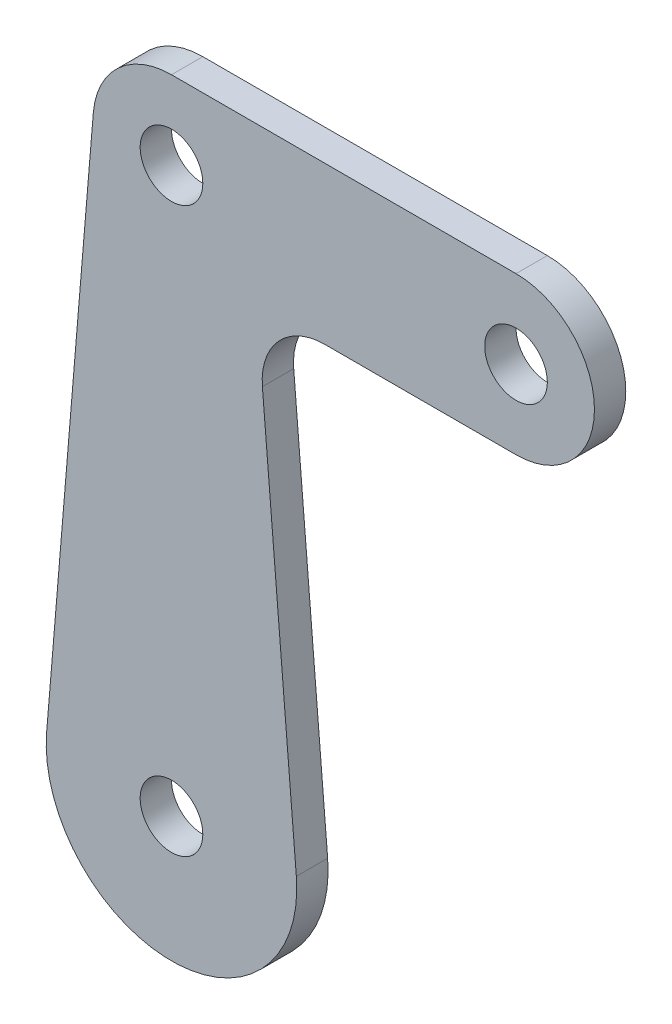
ISO-10303-21;
HEADER;
FILE_DESCRIPTION(('STEP AP214'),'2;1');
FILE_NAME('part.step','',(''),(''),'','','');
FILE_SCHEMA(('AUTOMOTIVE_DESIGN { 1 0 10303 214 1 1 1 1 }'));
ENDSEC;
DATA;
#1=APPLICATION_CONTEXT('core data for automotive mechanical design processes');
#2=APPLICATION_PROTOCOL_DEFINITION('international standard','automotive_design',2000,#1);
#3=PRODUCT_CONTEXT('',#1,'mechanical');
#4=PRODUCT('Part','Part','',(#3));
#5=PRODUCT_RELATED_PRODUCT_CATEGORY('part','',(#4));
#6=PRODUCT_DEFINITION_FORMATION('','',#4);
#7=PRODUCT_DEFINITION_CONTEXT('part definition',#1,'design');
#8=PRODUCT_DEFINITION('design','',#6,#7);
#9=PRODUCT_DEFINITION_SHAPE('','',#8);
#10=(LENGTH_UNIT() NAMED_UNIT(*) SI_UNIT(.MILLI.,.METRE.));
#11=(NAMED_UNIT(*) PLANE_ANGLE_UNIT() SI_UNIT($,.RADIAN.));
#12=(NAMED_UNIT(*) SI_UNIT($,.STERADIAN.) SOLID_ANGLE_UNIT());
#13=UNCERTAINTY_MEASURE_WITH_UNIT(LENGTH_MEASURE(1.E-05),#10,'distance_accuracy_value','');
#14=(GEOMETRIC_REPRESENTATION_CONTEXT(3) GLOBAL_UNCERTAINTY_ASSIGNED_CONTEXT((#13)) GLOBAL_UNIT_ASSIGNED_CONTEXT((#10,
#11,#12)) REPRESENTATION_CONTEXT('',''));
#15=CARTESIAN_POINT('',(0.,0.,0.));
#16=DIRECTION('',(0.,0.,1.));
#17=DIRECTION('',(1.,0.,0.));
#18=AXIS2_PLACEMENT_3D('',#15,#16,#17);
#19=CARTESIAN_POINT('',(0.,-57.15,3.175));
#20=DIRECTION('',(0.,0.,1.));
#21=DIRECTION('',(1.,0.,0.));
#22=AXIS2_PLACEMENT_3D('',#19,#20,#21);
#23=PLANE('',#22);
#24=CARTESIAN_POINT('',(34.925,0.,3.175));
#25=DIRECTION('',(0.,0.,1.));
#26=DIRECTION('',(1.,0.,0.));
#27=AXIS2_PLACEMENT_3D('',#24,#25,#26);
#28=CIRCLE('',#27,3.175);
#29=CARTESIAN_POINT('',(38.1,0.,3.175));
#30=VERTEX_POINT('',#29);
#31=EDGE_CURVE('E182',#30,#30,#28,.T.);
#32=ORIENTED_EDGE('',*,*,#31,.F.);
#33=EDGE_LOOP('',(#32));
#34=FACE_BOUND('',#33,.T.);
#35=CARTESIAN_POINT('',(0.,-57.15,3.175));
#36=DIRECTION('',(0.,0.,1.));
#37=DIRECTION('',(1.,0.,0.));
#38=AXIS2_PLACEMENT_3D('',#35,#36,#37);
#39=CIRCLE('',#38,12.7);
#40=CARTESIAN_POINT('',(-12.6560616423246,-56.0944888888889,3.175));
#41=VERTEX_POINT('',#40);
#42=CARTESIAN_POINT('',(12.6560616423246,-56.0944888888889,3.175));
#43=VERTEX_POINT('',#42);
#44=EDGE_CURVE('E145',#41,#43,#39,.T.);
#45=ORIENTED_EDGE('',*,*,#44,.T.);
#46=DIRECTION('',(-0.0831111111111112,0.996540286797216,0.));
#47=VECTOR('',#46,1.);
#48=CARTESIAN_POINT('',(12.6560616423246,-56.0944888888889,3.175));
#49=LINE('',#48,#47);
#50=CARTESIAN_POINT('',(9.21444720638468,-14.8279555555556,3.175));
#51=VERTEX_POINT('',#50);
#52=EDGE_CURVE('E93',#43,#51,#49,.T.);
#53=ORIENTED_EDGE('',*,*,#52,.T.);
#54=CARTESIAN_POINT('',(15.542478027547,-14.3002,3.175));
#55=DIRECTION('',(0.,0.,-1.));
#56=DIRECTION('',(1.,0.,0.));
#57=AXIS2_PLACEMENT_3D('',#54,#55,#56);
#58=CIRCLE('',#57,6.35);
#59=CARTESIAN_POINT('',(15.542478027547,-7.9502,3.175));
#60=VERTEX_POINT('',#59);
#61=EDGE_CURVE('E160',#51,#60,#58,.T.);
#62=ORIENTED_EDGE('',*,*,#61,.T.);
#63=DIRECTION('',(1.,0.,0.));
#64=VECTOR('',#63,1.);
#65=CARTESIAN_POINT('',(34.925,-7.9502,3.175));
#66=LINE('',#65,#64);
#67=CARTESIAN_POINT('',(34.925,-7.9502,3.175));
#68=VERTEX_POINT('',#67);
#69=EDGE_CURVE('E173',#60,#68,#66,.T.);
#70=ORIENTED_EDGE('',*,*,#69,.T.);
#71=CARTESIAN_POINT('',(34.925,0.,3.175));
#72=DIRECTION('',(0.,0.,1.));
#73=DIRECTION('',(-1.,0.,0.));
#74=AXIS2_PLACEMENT_3D('',#71,#72,#73);
#75=CIRCLE('',#74,7.9502);
#76=CARTESIAN_POINT('',(34.925,7.9502,3.175));
#77=VERTEX_POINT('',#76);
#78=EDGE_CURVE('E112',#68,#77,#75,.T.);
#79=ORIENTED_EDGE('',*,*,#78,.T.);
#80=DIRECTION('',(-1.,0.,0.));
#81=VECTOR('',#80,1.);
#82=CARTESIAN_POINT('',(0.,7.9502,3.175));
#83=LINE('',#82,#81);
#84=CARTESIAN_POINT('',(0.,7.9502,3.175));
#85=VERTEX_POINT('',#84);
#86=EDGE_CURVE('E106',#77,#85,#83,.T.);
#87=ORIENTED_EDGE('',*,*,#86,.T.);
#88=CARTESIAN_POINT('',(0.,0.,3.175));
#89=DIRECTION('',(0.,0.,1.));
#90=DIRECTION('',(-1.,0.,0.));
#91=AXIS2_PLACEMENT_3D('',#88,#89,#90);
#92=CIRCLE('',#91,7.9502);
#93=CARTESIAN_POINT('',(-7.92269458809522,0.660749955555555,3.175));
#94=VERTEX_POINT('',#93);
#95=EDGE_CURVE('E110',#85,#94,#92,.T.);
#96=ORIENTED_EDGE('',*,*,#95,.T.);
#97=DIRECTION('',(-0.0831111111111111,-0.996540286797216,0.));
#98=VECTOR('',#97,1.);
#99=CARTESIAN_POINT('',(-12.6560616423246,-56.0944888888889,3.175));
#100=LINE('',#99,#98);
#101=EDGE_CURVE('E50',#94,#41,#100,.T.);
#102=ORIENTED_EDGE('',*,*,#101,.T.);
#103=EDGE_LOOP('',(#45,#53,#62,#70,#79,#87,#96,#102));
#104=FACE_BOUND('',#103,.T.);
#105=CARTESIAN_POINT('',(0.,-57.15,3.175));
#106=DIRECTION('',(0.,0.,1.));
#107=DIRECTION('',(1.,0.,0.));
#108=AXIS2_PLACEMENT_3D('',#105,#106,#107);
#109=CIRCLE('',#108,3.175);
#110=CARTESIAN_POINT('',(3.175,-57.15,3.175));
#111=VERTEX_POINT('',#110);
#112=EDGE_CURVE('E134',#111,#111,#109,.T.);
#113=ORIENTED_EDGE('',*,*,#112,.F.);
#114=EDGE_LOOP('',(#113));
#115=FACE_BOUND('',#114,.T.);
#116=CARTESIAN_POINT('',(0.,0.,3.175));
#117=DIRECTION('',(0.,0.,1.));
#118=DIRECTION('',(1.,0.,0.));
#119=AXIS2_PLACEMENT_3D('',#116,#117,#118);
#120=CIRCLE('',#119,3.175);
#121=CARTESIAN_POINT('',(3.175,0.,3.175));
#122=VERTEX_POINT('',#121);
#123=EDGE_CURVE('E188',#122,#122,#120,.T.);
#124=ORIENTED_EDGE('',*,*,#123,.F.);
#125=EDGE_LOOP('',(#124));
#126=FACE_BOUND('',#125,.T.);
#127=ADVANCED_FACE('F33',(#34,#104,#115,#126),#23,.T.);
#128=CARTESIAN_POINT('',(0.,-57.15,0.));
#129=DIRECTION('',(0.,0.,1.));
#130=DIRECTION('',(1.,0.,0.));
#131=AXIS2_PLACEMENT_3D('',#128,#129,#130);
#132=PLANE('',#131);
#133=CARTESIAN_POINT('',(0.,-57.15,0.));
#134=DIRECTION('',(0.,0.,1.));
#135=DIRECTION('',(1.,0.,0.));
#136=AXIS2_PLACEMENT_3D('',#133,#134,#135);
#137=CIRCLE('',#136,12.7);
#138=CARTESIAN_POINT('',(-12.6560616423246,-56.0944888888889,0.));
#139=VERTEX_POINT('',#138);
#140=CARTESIAN_POINT('',(12.6560616423246,-56.0944888888889,0.));
#141=VERTEX_POINT('',#140);
#142=EDGE_CURVE('E130',#139,#141,#137,.T.);
#143=ORIENTED_EDGE('',*,*,#142,.F.);
#144=DIRECTION('',(-0.0831111111111111,-0.996540286797216,0.));
#145=VECTOR('',#144,1.);
#146=CARTESIAN_POINT('',(-12.6560616423246,-56.0944888888889,0.));
#147=LINE('',#146,#145);
#148=CARTESIAN_POINT('',(-7.92269458809522,0.660749955555555,0.));
#149=VERTEX_POINT('',#148);
#150=EDGE_CURVE('E85',#149,#139,#147,.T.);
#151=ORIENTED_EDGE('',*,*,#150,.F.);
#152=CARTESIAN_POINT('',(0.,0.,0.));
#153=DIRECTION('',(0.,0.,1.));
#154=DIRECTION('',(-1.,0.,0.));
#155=AXIS2_PLACEMENT_3D('',#152,#153,#154);
#156=CIRCLE('',#155,7.9502);
#157=CARTESIAN_POINT('',(0.,7.9502,0.));
#158=VERTEX_POINT('',#157);
#159=EDGE_CURVE('E79',#158,#149,#156,.T.);
#160=ORIENTED_EDGE('',*,*,#159,.F.);
#161=DIRECTION('',(-1.,0.,0.));
#162=VECTOR('',#161,1.);
#163=CARTESIAN_POINT('',(0.,7.9502,0.));
#164=LINE('',#163,#162);
#165=CARTESIAN_POINT('',(34.925,7.9502,0.));
#166=VERTEX_POINT('',#165);
#167=EDGE_CURVE('E120',#166,#158,#164,.T.);
#168=ORIENTED_EDGE('',*,*,#167,.F.);
#169=CARTESIAN_POINT('',(34.925,0.,0.));
#170=DIRECTION('',(0.,0.,1.));
#171=DIRECTION('',(-1.,0.,0.));
#172=AXIS2_PLACEMENT_3D('',#169,#170,#171);
#173=CIRCLE('',#172,7.9502);
#174=CARTESIAN_POINT('',(34.925,-7.9502,0.));
#175=VERTEX_POINT('',#174);
#176=EDGE_CURVE('E140',#175,#166,#173,.T.);
#177=ORIENTED_EDGE('',*,*,#176,.F.);
#178=DIRECTION('',(1.,0.,0.));
#179=VECTOR('',#178,1.);
#180=CARTESIAN_POINT('',(34.925,-7.9502,0.));
#181=LINE('',#180,#179);
#182=CARTESIAN_POINT('',(15.542478027547,-7.9502,0.));
#183=VERTEX_POINT('',#182);
#184=EDGE_CURVE('E138',#183,#175,#181,.T.);
#185=ORIENTED_EDGE('',*,*,#184,.F.);
#186=CARTESIAN_POINT('',(15.542478027547,-14.3002,0.));
#187=DIRECTION('',(0.,0.,-1.));
#188=DIRECTION('',(1.,0.,0.));
#189=AXIS2_PLACEMENT_3D('',#186,#187,#188);
#190=CIRCLE('',#189,6.35);
#191=CARTESIAN_POINT('',(9.21444720638468,-14.8279555555556,0.));
#192=VERTEX_POINT('',#191);
#193=EDGE_CURVE('E136',#192,#183,#190,.T.);
#194=ORIENTED_EDGE('',*,*,#193,.F.);
#195=DIRECTION('',(-0.0831111111111112,0.996540286797216,0.));
#196=VECTOR('',#195,1.);
#197=CARTESIAN_POINT('',(12.6560616423246,-56.0944888888889,0.));
#198=LINE('',#197,#196);
#199=EDGE_CURVE('E133',#141,#192,#198,.T.);
#200=ORIENTED_EDGE('',*,*,#199,.F.);
#201=EDGE_LOOP('',(#143,#151,#160,#168,#177,#185,#194,#200));
#202=FACE_BOUND('',#201,.T.);
#203=CARTESIAN_POINT('',(0.,-57.15,0.));
#204=DIRECTION('',(0.,0.,1.));
#205=DIRECTION('',(1.,0.,0.));
#206=AXIS2_PLACEMENT_3D('',#203,#204,#205);
#207=CIRCLE('',#206,3.175);
#208=CARTESIAN_POINT('',(3.175,-57.15,0.));
#209=VERTEX_POINT('',#208);
#210=EDGE_CURVE('E179',#209,#209,#207,.T.);
#211=ORIENTED_EDGE('',*,*,#210,.T.);
#212=EDGE_LOOP('',(#211));
#213=FACE_BOUND('',#212,.T.);
#214=CARTESIAN_POINT('',(34.925,0.,0.));
#215=DIRECTION('',(0.,0.,1.));
#216=DIRECTION('',(1.,0.,0.));
#217=AXIS2_PLACEMENT_3D('',#214,#215,#216);
#218=CIRCLE('',#217,3.175);
#219=CARTESIAN_POINT('',(38.1,0.,0.));
#220=VERTEX_POINT('',#219);
#221=EDGE_CURVE('E185',#220,#220,#218,.T.);
#222=ORIENTED_EDGE('',*,*,#221,.T.);
#223=EDGE_LOOP('',(#222));
#224=FACE_BOUND('',#223,.T.);
#225=CARTESIAN_POINT('',(0.,0.,0.));
#226=DIRECTION('',(0.,0.,1.));
#227=DIRECTION('',(1.,0.,0.));
#228=AXIS2_PLACEMENT_3D('',#225,#226,#227);
#229=CIRCLE('',#228,3.175);
#230=CARTESIAN_POINT('',(3.175,0.,0.));
#231=VERTEX_POINT('',#230);
#232=EDGE_CURVE('E191',#231,#231,#229,.T.);
#233=ORIENTED_EDGE('',*,*,#232,.T.);
#234=EDGE_LOOP('',(#233));
#235=FACE_BOUND('',#234,.T.);
#236=ADVANCED_FACE('F164',(#202,#213,#224,#235),#132,.F.);
#237=CARTESIAN_POINT('',(0.,-57.15,3.175));
#238=DIRECTION('',(0.,0.,-1.));
#239=DIRECTION('',(-1.,0.,0.));
#240=AXIS2_PLACEMENT_3D('',#237,#238,#239);
#241=CYLINDRICAL_SURFACE('',#240,12.7);
#242=ORIENTED_EDGE('',*,*,#142,.T.);
#243=DIRECTION('',(0.,0.,-1.));
#244=VECTOR('',#243,1.);
#245=CARTESIAN_POINT('',(12.6560616423246,-56.0944888888889,3.175));
#246=LINE('',#245,#244);
#247=EDGE_CURVE('E11',#43,#141,#246,.T.);
#248=ORIENTED_EDGE('',*,*,#247,.F.);
#249=ORIENTED_EDGE('',*,*,#44,.F.);
#250=DIRECTION('',(0.,0.,-1.));
#251=VECTOR('',#250,1.);
#252=CARTESIAN_POINT('',(-12.6560616423246,-56.0944888888889,3.175));
#253=LINE('',#252,#251);
#254=EDGE_CURVE('E126',#41,#139,#253,.T.);
#255=ORIENTED_EDGE('',*,*,#254,.T.);
#256=EDGE_LOOP('',(#242,#248,#249,#255));
#257=FACE_BOUND('',#256,.T.);
#258=ADVANCED_FACE('F35',(#257),#241,.T.);
#259=CARTESIAN_POINT('',(12.6560616423246,-56.0944888888889,3.175));
#260=DIRECTION('',(-0.996540286797216,-0.0831111111111112,0.));
#261=DIRECTION('',(0.0831111111111112,-0.996540286797216,0.));
#262=AXIS2_PLACEMENT_3D('',#259,#260,#261);
#263=PLANE('',#262);
#264=ORIENTED_EDGE('',*,*,#199,.T.);
#265=DIRECTION('',(0.,0.,-1.));
#266=VECTOR('',#265,1.);
#267=CARTESIAN_POINT('',(9.21444720638468,-14.8279555555556,3.175));
#268=LINE('',#267,#266);
#269=EDGE_CURVE('E42',#51,#192,#268,.T.);
#270=ORIENTED_EDGE('',*,*,#269,.F.);
#271=ORIENTED_EDGE('',*,*,#52,.F.);
#272=ORIENTED_EDGE('',*,*,#247,.T.);
#273=EDGE_LOOP('',(#264,#270,#271,#272));
#274=FACE_BOUND('',#273,.T.);
#275=ADVANCED_FACE('F224',(#274),#263,.F.);
#276=CARTESIAN_POINT('',(15.542478027547,-14.3002,3.175));
#277=DIRECTION('',(0.,0.,-1.));
#278=DIRECTION('',(-1.,0.,0.));
#279=AXIS2_PLACEMENT_3D('',#276,#277,#278);
#280=CYLINDRICAL_SURFACE('',#279,6.35);
#281=ORIENTED_EDGE('',*,*,#193,.T.);
#282=DIRECTION('',(0.,0.,-1.));
#283=VECTOR('',#282,1.);
#284=CARTESIAN_POINT('',(15.542478027547,-7.9502,3.175));
#285=LINE('',#284,#283);
#286=EDGE_CURVE('E152',#60,#183,#285,.T.);
#287=ORIENTED_EDGE('',*,*,#286,.F.);
#288=ORIENTED_EDGE('',*,*,#61,.F.);
#289=ORIENTED_EDGE('',*,*,#269,.T.);
#290=EDGE_LOOP('',(#281,#287,#288,#289));
#291=FACE_BOUND('',#290,.T.);
#292=ADVANCED_FACE('F158',(#291),#280,.F.);
#293=CARTESIAN_POINT('',(34.925,-7.9502,3.175));
#294=DIRECTION('',(0.,1.,0.));
#295=DIRECTION('',(-1.,0.,0.));
#296=AXIS2_PLACEMENT_3D('',#293,#294,#295);
#297=PLANE('',#296);
#298=ORIENTED_EDGE('',*,*,#184,.T.);
#299=DIRECTION('',(0.,0.,-1.));
#300=VECTOR('',#299,1.);
#301=CARTESIAN_POINT('',(34.925,-7.9502,3.175));
#302=LINE('',#301,#300);
#303=EDGE_CURVE('E149',#68,#175,#302,.T.);
#304=ORIENTED_EDGE('',*,*,#303,.F.);
#305=ORIENTED_EDGE('',*,*,#69,.F.);
#306=ORIENTED_EDGE('',*,*,#286,.T.);
#307=EDGE_LOOP('',(#298,#304,#305,#306));
#308=FACE_BOUND('',#307,.T.);
#309=ADVANCED_FACE('F169',(#308),#297,.F.);
#310=CARTESIAN_POINT('',(34.925,0.,3.175));
#311=DIRECTION('',(0.,0.,-1.));
#312=DIRECTION('',(-1.,0.,0.));
#313=AXIS2_PLACEMENT_3D('',#310,#311,#312);
#314=CYLINDRICAL_SURFACE('',#313,7.9502);
#315=ORIENTED_EDGE('',*,*,#176,.T.);
#316=DIRECTION('',(0.,0.,-1.));
#317=VECTOR('',#316,1.);
#318=CARTESIAN_POINT('',(34.925,7.9502,3.175));
#319=LINE('',#318,#317);
#320=EDGE_CURVE('E121',#77,#166,#319,.T.);
#321=ORIENTED_EDGE('',*,*,#320,.F.);
#322=ORIENTED_EDGE('',*,*,#78,.F.);
#323=ORIENTED_EDGE('',*,*,#303,.T.);
#324=EDGE_LOOP('',(#315,#321,#322,#323));
#325=FACE_BOUND('',#324,.T.);
#326=ADVANCED_FACE('F172',(#325),#314,.T.);
#327=CARTESIAN_POINT('',(0.,7.9502,3.175));
#328=DIRECTION('',(0.,-1.,0.));
#329=DIRECTION('',(0.,0.,-1.));
#330=AXIS2_PLACEMENT_3D('',#327,#328,#329);
#331=PLANE('',#330);
#332=ORIENTED_EDGE('',*,*,#167,.T.);
#333=DIRECTION('',(0.,0.,-1.));
#334=VECTOR('',#333,1.);
#335=CARTESIAN_POINT('',(0.,7.9502,3.175));
#336=LINE('',#335,#334);
#337=EDGE_CURVE('E117',#85,#158,#336,.T.);
#338=ORIENTED_EDGE('',*,*,#337,.F.);
#339=ORIENTED_EDGE('',*,*,#86,.F.);
#340=ORIENTED_EDGE('',*,*,#320,.T.);
#341=EDGE_LOOP('',(#332,#338,#339,#340));
#342=FACE_BOUND('',#341,.T.);
#343=ADVANCED_FACE('F118',(#342),#331,.F.);
#344=CARTESIAN_POINT('',(0.,0.,3.175));
#345=DIRECTION('',(0.,0.,-1.));
#346=DIRECTION('',(-1.,0.,0.));
#347=AXIS2_PLACEMENT_3D('',#344,#345,#346);
#348=CYLINDRICAL_SURFACE('',#347,7.9502);
#349=ORIENTED_EDGE('',*,*,#159,.T.);
#350=DIRECTION('',(0.,0.,-1.));
#351=VECTOR('',#350,1.);
#352=CARTESIAN_POINT('',(-7.92269458809522,0.660749955555555,3.175));
#353=LINE('',#352,#351);
#354=EDGE_CURVE('E122',#94,#149,#353,.T.);
#355=ORIENTED_EDGE('',*,*,#354,.F.);
#356=ORIENTED_EDGE('',*,*,#95,.F.);
#357=ORIENTED_EDGE('',*,*,#337,.T.);
#358=EDGE_LOOP('',(#349,#355,#356,#357));
#359=FACE_BOUND('',#358,.T.);
#360=ADVANCED_FACE('F124',(#359),#348,.T.);
#361=CARTESIAN_POINT('',(-12.6560616423246,-56.0944888888889,3.175));
#362=DIRECTION('',(0.996540286797215,-0.0831111111111111,0.));
#363=DIRECTION('',(0.0831111111111111,0.996540286797216,0.));
#364=AXIS2_PLACEMENT_3D('',#361,#362,#363);
#365=PLANE('',#364);
#366=ORIENTED_EDGE('',*,*,#150,.T.);
#367=ORIENTED_EDGE('',*,*,#254,.F.);
#368=ORIENTED_EDGE('',*,*,#101,.F.);
#369=ORIENTED_EDGE('',*,*,#354,.T.);
#370=EDGE_LOOP('',(#366,#367,#368,#369));
#371=FACE_BOUND('',#370,.T.);
#372=ADVANCED_FACE('F212',(#371),#365,.F.);
#373=CARTESIAN_POINT('',(0.,-57.15,3.175));
#374=DIRECTION('',(0.,0.,-1.));
#375=DIRECTION('',(-1.,0.,0.));
#376=AXIS2_PLACEMENT_3D('',#373,#374,#375);
#377=CYLINDRICAL_SURFACE('',#376,3.175);
#378=ORIENTED_EDGE('',*,*,#112,.T.);
#379=EDGE_LOOP('',(#378));
#380=FACE_BOUND('',#379,.T.);
#381=ORIENTED_EDGE('',*,*,#210,.F.);
#382=EDGE_LOOP('',(#381));
#383=FACE_BOUND('',#382,.T.);
#384=ADVANCED_FACE('F209',(#380,#383),#377,.F.);
#385=CARTESIAN_POINT('',(34.925,0.,3.175));
#386=DIRECTION('',(0.,0.,-1.));
#387=DIRECTION('',(-1.,0.,0.));
#388=AXIS2_PLACEMENT_3D('',#385,#386,#387);
#389=CYLINDRICAL_SURFACE('',#388,3.175);
#390=ORIENTED_EDGE('',*,*,#31,.T.);
#391=EDGE_LOOP('',(#390));
#392=FACE_BOUND('',#391,.T.);
#393=ORIENTED_EDGE('',*,*,#221,.F.);
#394=EDGE_LOOP('',(#393));
#395=FACE_BOUND('',#394,.T.);
#396=ADVANCED_FACE('F288',(#392,#395),#389,.F.);
#397=CARTESIAN_POINT('',(0.,0.,3.175));
#398=DIRECTION('',(0.,0.,-1.));
#399=DIRECTION('',(-1.,0.,0.));
#400=AXIS2_PLACEMENT_3D('',#397,#398,#399);
#401=CYLINDRICAL_SURFACE('',#400,3.175);
#402=ORIENTED_EDGE('',*,*,#123,.T.);
#403=EDGE_LOOP('',(#402));
#404=FACE_BOUND('',#403,.T.);
#405=ORIENTED_EDGE('',*,*,#232,.F.);
#406=EDGE_LOOP('',(#405));
#407=FACE_BOUND('',#406,.T.);
#408=ADVANCED_FACE('F197',(#404,#407),#401,.F.);
#409=CLOSED_SHELL('',(#127,#236,#258,#275,#292,#309,#326,#343,#360,#372,#384,#396,#408));
#410=MANIFOLD_SOLID_BREP('B2',#409);
#411=ADVANCED_BREP_SHAPE_REPRESENTATION('',(#18,#410),#14);
#412=SHAPE_DEFINITION_REPRESENTATION(#9,#411);
ENDSEC;
END-ISO-10303-21;
